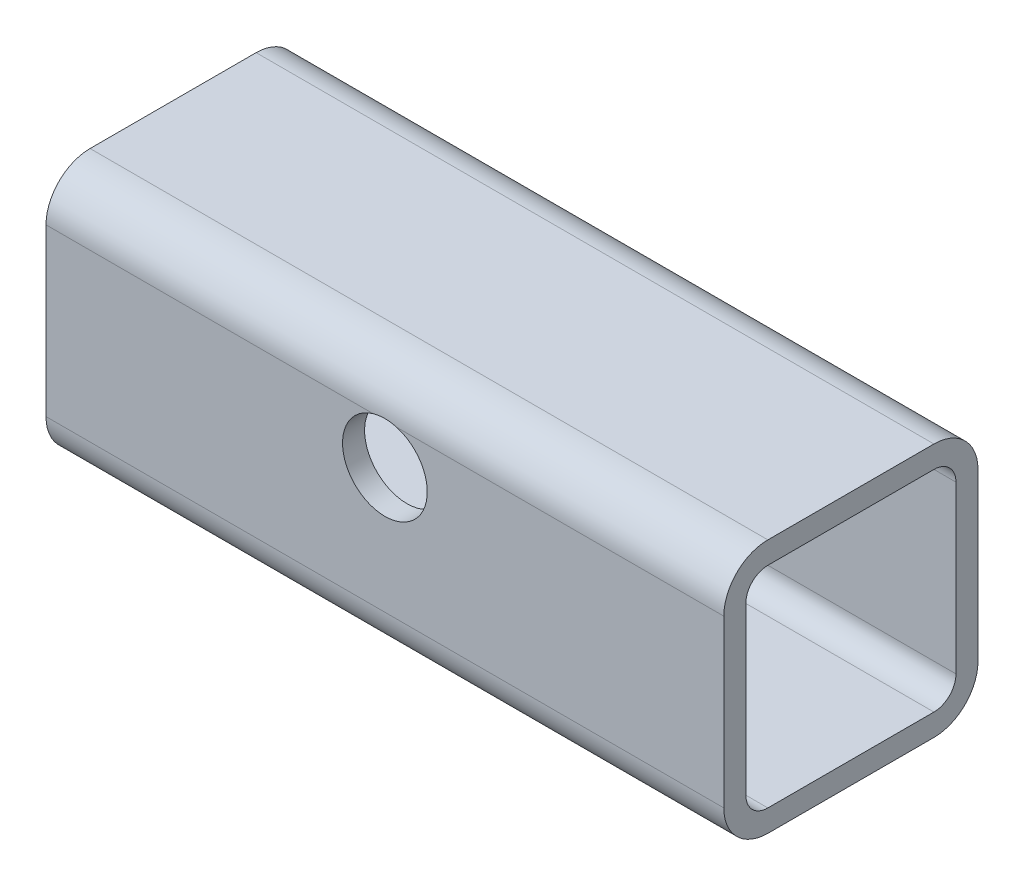
ISO-10303-21;
HEADER;
FILE_DESCRIPTION(('STEP AP214'),'2;1');
FILE_NAME('part.step','',(''),(''),'','','');
FILE_SCHEMA(('AUTOMOTIVE_DESIGN { 1 0 10303 214 1 1 1 1 }'));
ENDSEC;
DATA;
#1=APPLICATION_CONTEXT('core data for automotive mechanical design processes');
#2=APPLICATION_PROTOCOL_DEFINITION('international standard','automotive_design',2000,#1);
#3=PRODUCT_CONTEXT('',#1,'mechanical');
#4=PRODUCT('Part','Part','',(#3));
#5=PRODUCT_RELATED_PRODUCT_CATEGORY('part','',(#4));
#6=PRODUCT_DEFINITION_FORMATION('','',#4);
#7=PRODUCT_DEFINITION_CONTEXT('part definition',#1,'design');
#8=PRODUCT_DEFINITION('design','',#6,#7);
#9=PRODUCT_DEFINITION_SHAPE('','',#8);
#10=(LENGTH_UNIT() NAMED_UNIT(*) SI_UNIT(.MILLI.,.METRE.));
#11=(NAMED_UNIT(*) PLANE_ANGLE_UNIT() SI_UNIT($,.RADIAN.));
#12=(NAMED_UNIT(*) SI_UNIT($,.STERADIAN.) SOLID_ANGLE_UNIT());
#13=UNCERTAINTY_MEASURE_WITH_UNIT(LENGTH_MEASURE(1.E-05),#10,'distance_accuracy_value','');
#14=(GEOMETRIC_REPRESENTATION_CONTEXT(3) GLOBAL_UNCERTAINTY_ASSIGNED_CONTEXT((#13)) GLOBAL_UNIT_ASSIGNED_CONTEXT((#10,
#11,#12)) REPRESENTATION_CONTEXT('',''));
#15=CARTESIAN_POINT('',(0.,0.,0.));
#16=DIRECTION('',(0.,0.,1.));
#17=DIRECTION('',(1.,0.,0.));
#18=AXIS2_PLACEMENT_3D('',#15,#16,#17);
#19=CARTESIAN_POINT('',(80.,9.8,-9.8));
#20=DIRECTION('',(-1.,0.,0.));
#21=DIRECTION('',(0.,0.,1.));
#22=AXIS2_PLACEMENT_3D('',#19,#20,#21);
#23=CYLINDRICAL_SURFACE('',#22,5.2);
#24=DIRECTION('',(-1.,0.,0.));
#25=VECTOR('',#24,1.);
#26=CARTESIAN_POINT('',(80.,9.8,-15.));
#27=LINE('',#26,#25);
#28=CARTESIAN_POINT('',(80.,9.8,-15.));
#29=VERTEX_POINT('',#28);
#30=CARTESIAN_POINT('',(41.4,9.8,-15.));
#31=VERTEX_POINT('',#30);
#32=EDGE_CURVE('E221',#29,#31,#27,.T.);
#33=ORIENTED_EDGE('',*,*,#32,.T.);
#34=CARTESIAN_POINT('',(41.4,9.8,-15.));
#35=CARTESIAN_POINT('',(41.3431557849591,9.81658156900363,-14.9999989720538));
#36=CARTESIAN_POINT('',(41.286021326728,9.83217072184021,-14.9999206417086));
#37=CARTESIAN_POINT('',(41.1714574071763,9.86126958309429,-14.9996595849438));
#38=CARTESIAN_POINT('',(41.1140298994615,9.87478698863816,-14.9994772574498));
#39=CARTESIAN_POINT('',(40.9988797943995,9.8997424563217,-14.999058191233));
#40=CARTESIAN_POINT('',(40.9411583397528,9.91118579016138,-14.9988215940214));
#41=CARTESIAN_POINT('',(40.8254214126575,9.93199648240796,-14.9983348625246));
#42=CARTESIAN_POINT('',(40.767406431461,9.94136657295405,-14.9980847466022));
#43=CARTESIAN_POINT('',(40.6510830015136,9.95803381823512,-14.9976047161396));
#44=CARTESIAN_POINT('',(40.5927745710078,9.96533110026478,-14.9973748003595));
#45=CARTESIAN_POINT('',(40.4758647152712,9.97785607418654,-14.9969612805748));
#46=CARTESIAN_POINT('',(40.417263021649,9.98308126165223,-14.9967777327092));
#47=CARTESIAN_POINT('',(40.2997668530483,9.99146529931364,-14.9964756017275));
#48=CARTESIAN_POINT('',(40.2408720124452,9.99461902658301,-14.9963571797911));
#49=CARTESIAN_POINT('',(40.1227897461331,9.99886309022252,-14.9961964921282));
#50=CARTESIAN_POINT('',(40.0636020449673,9.99994573669491,-14.9961545102505));
#51=CARTESIAN_POINT('',(39.944852214256,10.0000506969647,-14.9961504724372));
#52=CARTESIAN_POINT('',(39.8852900727852,9.99905999991858,-14.9961889212272));
#53=CARTESIAN_POINT('',(39.7664607754381,9.99497347815472,-14.9963438604463));
#54=CARTESIAN_POINT('',(39.7071933492617,9.9918855378676,-14.9964600585584));
#55=CARTESIAN_POINT('',(39.5889538289225,9.98360661333948,-14.996759156126));
#56=CARTESIAN_POINT('',(39.5299813668472,9.9784208831061,-14.9969418888292));
#57=CARTESIAN_POINT('',(39.4123318114976,9.96594846677554,-14.9973550932175));
#58=CARTESIAN_POINT('',(39.3536544457772,9.95866434976154,-14.9975855064303));
#59=CARTESIAN_POINT('',(39.2365949809501,9.94199711915556,-14.9980675601698));
#60=CARTESIAN_POINT('',(39.1782129003298,9.93261387577145,-14.9983192020086));
#61=CARTESIAN_POINT('',(39.0617436033638,9.91175062117661,-14.9988095358786));
#62=CARTESIAN_POINT('',(39.0036568887756,9.90026780884889,-14.9990482100506));
#63=CARTESIAN_POINT('',(38.8877780887966,9.87520716701831,-14.9994713258104));
#64=CARTESIAN_POINT('',(38.8299871725611,9.86162393250286,-14.9996556238099));
#65=CARTESIAN_POINT('',(38.7146982157603,9.83236730610073,-14.9999196380707));
#66=CARTESIAN_POINT('',(38.6572021761365,9.81668602342061,-14.9999989465565));
#67=CARTESIAN_POINT('',(38.6,9.8,-15.));
#68=B_SPLINE_CURVE_WITH_KNOTS('',3,(#34,#35,#36,#37,#38,#39,#40,#41,#42,#43,#44,#45,#46,#47,#48,
#49,#50,#51,#52,#53,#54,#55,#56,#57,#58,#59,#60,#61,#62,#63,#64,#65,#66,#67),.UNSPECIFIED.,.F.,
.F.,(4,2,2,2,2,2,2,2,2,2,2,2,2,2,2,2,4),(0.,0.17763186849784,0.354586892821938,0.53108563987598,
0.707350391326903,0.883604315721005,1.06007062393831,1.2369717238554,1.41452839012144,
1.59320261698632,1.77120882251429,1.94877193689589,2.12611857561295,2.30347618297124,
2.48107215983797,2.65913299220168,2.83788339713574),.UNSPECIFIED.);
#69=CARTESIAN_POINT('',(38.6,9.8,-15.));
#70=VERTEX_POINT('',#69);
#71=EDGE_CURVE('E210',#31,#70,#68,.T.);
#72=ORIENTED_EDGE('',*,*,#71,.T.);
#73=CARTESIAN_POINT('',(0.,9.8,-15.));
#74=VERTEX_POINT('',#73);
#75=EDGE_CURVE('E72',#70,#74,#27,.T.);
#76=ORIENTED_EDGE('',*,*,#75,.T.);
#77=CARTESIAN_POINT('',(0.,9.8,-9.8));
#78=DIRECTION('',(1.,0.,0.));
#79=DIRECTION('',(0.,0.,-1.));
#80=AXIS2_PLACEMENT_3D('',#77,#78,#79);
#81=CIRCLE('',#80,5.2);
#82=CARTESIAN_POINT('',(0.,15.,-9.8));
#83=VERTEX_POINT('',#82);
#84=EDGE_CURVE('E446',#74,#83,#81,.T.);
#85=ORIENTED_EDGE('',*,*,#84,.T.);
#86=DIRECTION('',(-1.,0.,0.));
#87=VECTOR('',#86,1.);
#88=CARTESIAN_POINT('',(80.,15.,-9.8));
#89=LINE('',#88,#87);
#90=CARTESIAN_POINT('',(80.,15.,-9.8));
#91=VERTEX_POINT('',#90);
#92=EDGE_CURVE('E79',#91,#83,#89,.T.);
#93=ORIENTED_EDGE('',*,*,#92,.F.);
#94=CARTESIAN_POINT('',(80.,9.8,-9.8));
#95=DIRECTION('',(1.,0.,0.));
#96=DIRECTION('',(0.,0.,-1.));
#97=AXIS2_PLACEMENT_3D('',#94,#95,#96);
#98=CIRCLE('',#97,5.2);
#99=EDGE_CURVE('E389',#29,#91,#98,.T.);
#100=ORIENTED_EDGE('',*,*,#99,.F.);
#101=EDGE_LOOP('',(#33,#72,#76,#85,#93,#100));
#102=FACE_BOUND('',#101,.T.);
#103=ADVANCED_FACE('F67',(#102),#23,.T.);
#104=CARTESIAN_POINT('',(80.,15.,-9.8));
#105=DIRECTION('',(0.,-1.,0.));
#106=DIRECTION('',(0.,0.,-1.));
#107=AXIS2_PLACEMENT_3D('',#104,#105,#106);
#108=PLANE('',#107);
#109=DIRECTION('',(0.,0.,1.));
#110=VECTOR('',#109,1.);
#111=CARTESIAN_POINT('',(0.,15.,-9.8));
#112=LINE('',#111,#110);
#113=CARTESIAN_POINT('',(0.,15.,9.8));
#114=VERTEX_POINT('',#113);
#115=EDGE_CURVE('E329',#83,#114,#112,.T.);
#116=ORIENTED_EDGE('',*,*,#115,.T.);
#117=DIRECTION('',(-1.,0.,0.));
#118=VECTOR('',#117,1.);
#119=CARTESIAN_POINT('',(80.,15.,9.8));
#120=LINE('',#119,#118);
#121=CARTESIAN_POINT('',(80.,15.,9.8));
#122=VERTEX_POINT('',#121);
#123=EDGE_CURVE('E308',#122,#114,#120,.T.);
#124=ORIENTED_EDGE('',*,*,#123,.F.);
#125=DIRECTION('',(0.,0.,1.));
#126=VECTOR('',#125,1.);
#127=CARTESIAN_POINT('',(80.,15.,-9.8));
#128=LINE('',#127,#126);
#129=EDGE_CURVE('E393',#91,#122,#128,.T.);
#130=ORIENTED_EDGE('',*,*,#129,.F.);
#131=ORIENTED_EDGE('',*,*,#92,.T.);
#132=EDGE_LOOP('',(#116,#124,#130,#131));
#133=FACE_BOUND('',#132,.T.);
#134=ADVANCED_FACE('F269',(#133),#108,.F.);
#135=CARTESIAN_POINT('',(80.,9.8,9.8));
#136=DIRECTION('',(-1.,0.,0.));
#137=DIRECTION('',(0.,0.,1.));
#138=AXIS2_PLACEMENT_3D('',#135,#136,#137);
#139=CYLINDRICAL_SURFACE('',#138,5.2);
#140=DIRECTION('',(-1.,0.,0.));
#141=VECTOR('',#140,1.);
#142=CARTESIAN_POINT('',(80.,9.8,15.));
#143=LINE('',#142,#141);
#144=CARTESIAN_POINT('',(38.6,9.8,15.));
#145=VERTEX_POINT('',#144);
#146=CARTESIAN_POINT('',(0.,9.8,15.));
#147=VERTEX_POINT('',#146);
#148=EDGE_CURVE('E256',#145,#147,#143,.T.);
#149=ORIENTED_EDGE('',*,*,#148,.F.);
#150=CARTESIAN_POINT('',(41.4,9.8,15.));
#151=CARTESIAN_POINT('',(41.3491529439053,9.81483111826522,14.9999681171442));
#152=CARTESIAN_POINT('',(41.2980659313895,9.82885426510369,14.9998816291476));
#153=CARTESIAN_POINT('',(41.1702236160274,9.86177129020494,14.9995773230793));
#154=CARTESIAN_POINT('',(41.0932091518936,9.87966586781765,14.999315820023));
#155=CARTESIAN_POINT('',(40.9675489848588,9.90573953980025,14.9988648614268));
#156=CARTESIAN_POINT('',(40.919132569777,9.91504078543099,14.9986853197788));
#157=CARTESIAN_POINT('',(40.8156265798665,9.93334248611603,14.9982838171331));
#158=CARTESIAN_POINT('',(40.7605010185025,9.94214060260012,14.9980593861503));
#159=CARTESIAN_POINT('',(40.6451607598279,9.95857344700013,14.9975924905294));
#160=CARTESIAN_POINT('',(40.5849219431464,9.96603953767956,14.9973501621667));
#161=CARTESIAN_POINT('',(40.4726214262681,9.97788691407513,14.996937353483));
#162=CARTESIAN_POINT('',(40.42058932418,9.98255301021599,14.9967615671056));
#163=CARTESIAN_POINT('',(40.2895981127596,9.9922329437804,14.9963343411834));
#164=CARTESIAN_POINT('',(40.2105570463711,9.99619077203564,14.9960905048359));
#165=CARTESIAN_POINT('',(40.0861879869144,9.99946247042069,14.995996280124));
#166=CARTESIAN_POINT('',(40.0408879409496,10.0000381300058,14.9960222824834));
#167=CARTESIAN_POINT('',(39.9170033897098,9.9999285301096,14.9963783790303));
#168=CARTESIAN_POINT('',(39.8384162838065,9.99800618914163,14.9969178478119));
#169=CARTESIAN_POINT('',(39.6814228876373,9.99045943770584,14.9977383972759));
#170=CARTESIAN_POINT('',(39.6030165966295,9.98483504245588,14.9980194790204));
#171=CARTESIAN_POINT('',(39.4465555025581,9.96989683767829,14.9985605180255));
#172=CARTESIAN_POINT('',(39.3685006983395,9.96058304028342,14.9988204753555));
#173=CARTESIAN_POINT('',(39.2129170260502,9.93828681073101,14.9992557729465));
#174=CARTESIAN_POINT('',(39.1353881566828,9.92530438762181,14.9994311134161));
#175=CARTESIAN_POINT('',(38.9810285464381,9.89569932705631,14.9997138858353));
#176=CARTESIAN_POINT('',(38.9041978044131,9.87907669558545,14.9998213178964));
#177=CARTESIAN_POINT('',(38.7514048774857,9.84222986345656,14.9999649319156));
#178=CARTESIAN_POINT('',(38.6754426918693,9.82200566575936,15.0000011139323));
#179=CARTESIAN_POINT('',(38.6,9.8,15.));
#180=B_SPLINE_CURVE_WITH_KNOTS('',3,(#150,#151,#152,#153,#154,#155,#156,#157,#158,#159,#160,
#161,#162,#163,#164,#165,#166,#167,#168,#169,#170,#171,#172,#173,#174,#175,#176,#177,#178,#179),
.UNSPECIFIED.,.F.,.F.,(4,2,2,2,2,2,2,2,2,2,2,2,2,2,4),(0.,0.158900873713678,0.396002356912593,
0.543889968775195,0.711329269925978,0.893387288422519,1.0500895569875,1.28740664797233,
1.42330547136926,1.65904608749389,1.89478573457621,2.13052460642471,2.36626289684981,
2.60200079966336,2.83773850867815),.UNSPECIFIED.);
#181=CARTESIAN_POINT('',(41.4,9.8,15.));
#182=VERTEX_POINT('',#181);
#183=EDGE_CURVE('E86',#182,#145,#180,.T.);
#184=ORIENTED_EDGE('',*,*,#183,.F.);
#185=CARTESIAN_POINT('',(80.,9.8,15.));
#186=VERTEX_POINT('',#185);
#187=EDGE_CURVE('E311',#186,#182,#143,.T.);
#188=ORIENTED_EDGE('',*,*,#187,.F.);
#189=CARTESIAN_POINT('',(80.,9.8,9.8));
#190=DIRECTION('',(1.,0.,0.));
#191=DIRECTION('',(0.,0.,-1.));
#192=AXIS2_PLACEMENT_3D('',#189,#190,#191);
#193=CIRCLE('',#192,5.2);
#194=EDGE_CURVE('E396',#122,#186,#193,.T.);
#195=ORIENTED_EDGE('',*,*,#194,.F.);
#196=ORIENTED_EDGE('',*,*,#123,.T.);
#197=CARTESIAN_POINT('',(0.,9.8,9.8));
#198=DIRECTION('',(1.,0.,0.));
#199=DIRECTION('',(0.,0.,-1.));
#200=AXIS2_PLACEMENT_3D('',#197,#198,#199);
#201=CIRCLE('',#200,5.2);
#202=EDGE_CURVE('E324',#114,#147,#201,.T.);
#203=ORIENTED_EDGE('',*,*,#202,.T.);
#204=EDGE_LOOP('',(#149,#184,#188,#195,#196,#203));
#205=FACE_BOUND('',#204,.T.);
#206=ADVANCED_FACE('F258',(#205),#139,.T.);
#207=CARTESIAN_POINT('',(80.,-9.8,15.));
#208=DIRECTION('',(0.,0.,-1.));
#209=DIRECTION('',(-1.,0.,0.));
#210=AXIS2_PLACEMENT_3D('',#207,#208,#209);
#211=PLANE('',#210);
#212=ORIENTED_EDGE('',*,*,#187,.T.);
#213=CARTESIAN_POINT('',(40.,5.,15.));
#214=DIRECTION('',(0.,0.,1.));
#215=DIRECTION('',(1.,0.,0.));
#216=AXIS2_PLACEMENT_3D('',#213,#214,#215);
#217=CIRCLE('',#216,5.);
#218=EDGE_CURVE('E322',#145,#182,#217,.T.);
#219=ORIENTED_EDGE('',*,*,#218,.F.);
#220=ORIENTED_EDGE('',*,*,#148,.T.);
#221=DIRECTION('',(0.,-1.,0.));
#222=VECTOR('',#221,1.);
#223=CARTESIAN_POINT('',(0.,-9.8,15.));
#224=LINE('',#223,#222);
#225=CARTESIAN_POINT('',(0.,-9.8,15.));
#226=VERTEX_POINT('',#225);
#227=EDGE_CURVE('E321',#147,#226,#224,.T.);
#228=ORIENTED_EDGE('',*,*,#227,.T.);
#229=DIRECTION('',(-1.,0.,0.));
#230=VECTOR('',#229,1.);
#231=CARTESIAN_POINT('',(80.,-9.8,15.));
#232=LINE('',#231,#230);
#233=CARTESIAN_POINT('',(80.,-9.8,15.));
#234=VERTEX_POINT('',#233);
#235=EDGE_CURVE('E303',#234,#226,#232,.T.);
#236=ORIENTED_EDGE('',*,*,#235,.F.);
#237=DIRECTION('',(0.,-1.,0.));
#238=VECTOR('',#237,1.);
#239=CARTESIAN_POINT('',(80.,-9.8,15.));
#240=LINE('',#239,#238);
#241=EDGE_CURVE('E399',#186,#234,#240,.T.);
#242=ORIENTED_EDGE('',*,*,#241,.F.);
#243=EDGE_LOOP('',(#212,#219,#220,#228,#236,#242));
#244=FACE_BOUND('',#243,.T.);
#245=ADVANCED_FACE('F268',(#244),#211,.F.);
#246=CARTESIAN_POINT('',(80.,-9.8,9.8));
#247=DIRECTION('',(-1.,0.,0.));
#248=DIRECTION('',(0.,0.,1.));
#249=AXIS2_PLACEMENT_3D('',#246,#247,#248);
#250=CYLINDRICAL_SURFACE('',#249,5.2);
#251=CARTESIAN_POINT('',(0.,-9.8,9.8));
#252=DIRECTION('',(1.,0.,0.));
#253=DIRECTION('',(0.,0.,-1.));
#254=AXIS2_PLACEMENT_3D('',#251,#252,#253);
#255=CIRCLE('',#254,5.2);
#256=CARTESIAN_POINT('',(0.,-15.,9.8));
#257=VERTEX_POINT('',#256);
#258=EDGE_CURVE('E334',#226,#257,#255,.T.);
#259=ORIENTED_EDGE('',*,*,#258,.T.);
#260=DIRECTION('',(-1.,0.,0.));
#261=VECTOR('',#260,1.);
#262=CARTESIAN_POINT('',(80.,-15.,9.8));
#263=LINE('',#262,#261);
#264=CARTESIAN_POINT('',(80.,-15.,9.8));
#265=VERTEX_POINT('',#264);
#266=EDGE_CURVE('E299',#265,#257,#263,.T.);
#267=ORIENTED_EDGE('',*,*,#266,.F.);
#268=CARTESIAN_POINT('',(80.,-9.8,9.8));
#269=DIRECTION('',(1.,0.,0.));
#270=DIRECTION('',(0.,0.,-1.));
#271=AXIS2_PLACEMENT_3D('',#268,#269,#270);
#272=CIRCLE('',#271,5.2);
#273=EDGE_CURVE('E402',#234,#265,#272,.T.);
#274=ORIENTED_EDGE('',*,*,#273,.F.);
#275=ORIENTED_EDGE('',*,*,#235,.T.);
#276=EDGE_LOOP('',(#259,#267,#274,#275));
#277=FACE_BOUND('',#276,.T.);
#278=ADVANCED_FACE('F552',(#277),#250,.T.);
#279=CARTESIAN_POINT('',(80.,-15.,9.8));
#280=DIRECTION('',(0.,1.,0.));
#281=DIRECTION('',(0.,0.,1.));
#282=AXIS2_PLACEMENT_3D('',#279,#280,#281);
#283=PLANE('',#282);
#284=DIRECTION('',(0.,0.,-1.));
#285=VECTOR('',#284,1.);
#286=CARTESIAN_POINT('',(0.,-15.,9.8));
#287=LINE('',#286,#285);
#288=CARTESIAN_POINT('',(0.,-15.,-9.8));
#289=VERTEX_POINT('',#288);
#290=EDGE_CURVE('E338',#257,#289,#287,.T.);
#291=ORIENTED_EDGE('',*,*,#290,.T.);
#292=DIRECTION('',(-1.,0.,0.));
#293=VECTOR('',#292,1.);
#294=CARTESIAN_POINT('',(80.,-15.,-9.8));
#295=LINE('',#294,#293);
#296=CARTESIAN_POINT('',(80.,-15.,-9.8));
#297=VERTEX_POINT('',#296);
#298=EDGE_CURVE('E295',#297,#289,#295,.T.);
#299=ORIENTED_EDGE('',*,*,#298,.F.);
#300=DIRECTION('',(0.,0.,-1.));
#301=VECTOR('',#300,1.);
#302=CARTESIAN_POINT('',(80.,-15.,9.8));
#303=LINE('',#302,#301);
#304=EDGE_CURVE('E405',#265,#297,#303,.T.);
#305=ORIENTED_EDGE('',*,*,#304,.F.);
#306=ORIENTED_EDGE('',*,*,#266,.T.);
#307=EDGE_LOOP('',(#291,#299,#305,#306));
#308=FACE_BOUND('',#307,.T.);
#309=ADVANCED_FACE('F547',(#308),#283,.F.);
#310=CARTESIAN_POINT('',(80.,-9.8,-9.8));
#311=DIRECTION('',(-1.,0.,0.));
#312=DIRECTION('',(0.,0.,1.));
#313=AXIS2_PLACEMENT_3D('',#310,#311,#312);
#314=CYLINDRICAL_SURFACE('',#313,5.2);
#315=CARTESIAN_POINT('',(0.,-9.8,-9.8));
#316=DIRECTION('',(1.,0.,0.));
#317=DIRECTION('',(0.,0.,-1.));
#318=AXIS2_PLACEMENT_3D('',#315,#316,#317);
#319=CIRCLE('',#318,5.2);
#320=CARTESIAN_POINT('',(0.,-9.8,-15.));
#321=VERTEX_POINT('',#320);
#322=EDGE_CURVE('E343',#289,#321,#319,.T.);
#323=ORIENTED_EDGE('',*,*,#322,.T.);
#324=DIRECTION('',(-1.,0.,0.));
#325=VECTOR('',#324,1.);
#326=CARTESIAN_POINT('',(80.,-9.8,-15.));
#327=LINE('',#326,#325);
#328=CARTESIAN_POINT('',(80.,-9.8,-15.));
#329=VERTEX_POINT('',#328);
#330=EDGE_CURVE('E235',#329,#321,#327,.T.);
#331=ORIENTED_EDGE('',*,*,#330,.F.);
#332=CARTESIAN_POINT('',(80.,-9.8,-9.8));
#333=DIRECTION('',(1.,0.,0.));
#334=DIRECTION('',(0.,0.,-1.));
#335=AXIS2_PLACEMENT_3D('',#332,#333,#334);
#336=CIRCLE('',#335,5.2);
#337=EDGE_CURVE('E408',#297,#329,#336,.T.);
#338=ORIENTED_EDGE('',*,*,#337,.F.);
#339=ORIENTED_EDGE('',*,*,#298,.T.);
#340=EDGE_LOOP('',(#323,#331,#338,#339));
#341=FACE_BOUND('',#340,.T.);
#342=ADVANCED_FACE('F542',(#341),#314,.T.);
#343=CARTESIAN_POINT('',(80.,9.8,9.8));
#344=DIRECTION('',(-1.,0.,0.));
#345=DIRECTION('',(0.,0.,1.));
#346=AXIS2_PLACEMENT_3D('',#343,#344,#345);
#347=CYLINDRICAL_SURFACE('',#346,2.6);
#348=CARTESIAN_POINT('',(38.6,9.8,12.4));
#349=CARTESIAN_POINT('',(38.6682218028846,9.81989801218617,12.3999963920888));
#350=CARTESIAN_POINT('',(38.7368586872689,9.83833872609493,12.3997720826648));
#351=CARTESIAN_POINT('',(38.8748536764175,9.87227825565255,12.3990512345332));
#352=CARTESIAN_POINT('',(38.94421177114,9.88777711220434,12.3985546996109));
#353=CARTESIAN_POINT('',(39.153203818833,9.92982000850826,12.3969105248649));
#354=CARTESIAN_POINT('',(39.2937589814304,9.95191137956892,12.3956082978441));
#355=CARTESIAN_POINT('',(39.5729353294105,9.98366253841054,12.393552550057));
#356=CARTESIAN_POINT('',(39.7115251990587,9.99360016520899,12.3927869438548));
#357=CARTESIAN_POINT('',(39.9889953313389,10.001914430985,12.392149721752));
#358=CARTESIAN_POINT('',(40.1278754907363,10.00029464967,12.3922778290388));
#359=CARTESIAN_POINT('',(40.4566972047727,9.98273704661954,12.3935990279105));
#360=CARTESIAN_POINT('',(40.6463990808293,9.96169312354255,12.3951708571664));
#361=CARTESIAN_POINT('',(40.9296452115551,9.9137719603034,12.397555537091));
#362=CARTESIAN_POINT('',(41.0246115505461,9.89484914502915,12.3983616050628));
#363=CARTESIAN_POINT('',(41.2133055625079,9.8515207942107,12.3995779711224));
#364=CARTESIAN_POINT('',(41.3070330082341,9.82711426719503,12.3999881975698));
#365=CARTESIAN_POINT('',(41.4,9.8,12.4));
#366=B_SPLINE_CURVE_WITH_KNOTS('',3,(#348,#349,#350,#351,#352,#353,#354,#355,#356,#357,#358,
#359,#360,#361,#362,#363,#364,#365),.UNSPECIFIED.,.F.,.F.,(4,2,2,2,2,2,2,2,4),(0.,
0.213158048087099,0.426313132255314,0.852612567278017,1.26897263338285,1.68520374474832,
2.25639796525296,2.5467700750208,2.83719472724097),.UNSPECIFIED.);
#367=CARTESIAN_POINT('',(38.6,9.8,12.4));
#368=VERTEX_POINT('',#367);
#369=CARTESIAN_POINT('',(41.4,9.8,12.4));
#370=VERTEX_POINT('',#369);
#371=EDGE_CURVE('E496',#368,#370,#366,.T.);
#372=ORIENTED_EDGE('',*,*,#371,.F.);
#373=DIRECTION('',(-1.,0.,0.));
#374=VECTOR('',#373,1.);
#375=CARTESIAN_POINT('',(80.,9.8,12.4));
#376=LINE('',#375,#374);
#377=CARTESIAN_POINT('',(0.,9.8,12.4));
#378=VERTEX_POINT('',#377);
#379=EDGE_CURVE('E414',#368,#378,#376,.T.);
#380=ORIENTED_EDGE('',*,*,#379,.T.);
#381=CARTESIAN_POINT('',(0.,9.8,9.8));
#382=DIRECTION('',(1.,0.,0.));
#383=DIRECTION('',(0.,0.,-1.));
#384=AXIS2_PLACEMENT_3D('',#381,#382,#383);
#385=CIRCLE('',#384,2.6);
#386=CARTESIAN_POINT('',(0.,12.4,9.8));
#387=VERTEX_POINT('',#386);
#388=EDGE_CURVE('E223',#387,#378,#385,.T.);
#389=ORIENTED_EDGE('',*,*,#388,.F.);
#390=DIRECTION('',(-1.,0.,0.));
#391=VECTOR('',#390,1.);
#392=CARTESIAN_POINT('',(80.,12.4,9.8));
#393=LINE('',#392,#391);
#394=CARTESIAN_POINT('',(80.,12.4,9.8));
#395=VERTEX_POINT('',#394);
#396=EDGE_CURVE('E232',#395,#387,#393,.T.);
#397=ORIENTED_EDGE('',*,*,#396,.F.);
#398=CARTESIAN_POINT('',(80.,9.8,9.8));
#399=DIRECTION('',(1.,0.,0.));
#400=DIRECTION('',(0.,0.,-1.));
#401=AXIS2_PLACEMENT_3D('',#398,#399,#400);
#402=CIRCLE('',#401,2.6);
#403=CARTESIAN_POINT('',(80.,9.8,12.4));
#404=VERTEX_POINT('',#403);
#405=EDGE_CURVE('E349',#395,#404,#402,.T.);
#406=ORIENTED_EDGE('',*,*,#405,.T.);
#407=EDGE_CURVE('E453',#404,#370,#376,.T.);
#408=ORIENTED_EDGE('',*,*,#407,.T.);
#409=EDGE_LOOP('',(#372,#380,#389,#397,#406,#408));
#410=FACE_BOUND('',#409,.T.);
#411=ADVANCED_FACE('F69',(#410),#347,.F.);
#412=CARTESIAN_POINT('',(80.,12.4,-9.8));
#413=DIRECTION('',(0.,-1.,0.));
#414=DIRECTION('',(0.,0.,-1.));
#415=AXIS2_PLACEMENT_3D('',#412,#413,#414);
#416=PLANE('',#415);
#417=DIRECTION('',(0.,0.,1.));
#418=VECTOR('',#417,1.);
#419=CARTESIAN_POINT('',(0.,12.4,-9.8));
#420=LINE('',#419,#418);
#421=CARTESIAN_POINT('',(0.,12.4,-9.8));
#422=VERTEX_POINT('',#421);
#423=EDGE_CURVE('E418',#422,#387,#420,.T.);
#424=ORIENTED_EDGE('',*,*,#423,.F.);
#425=DIRECTION('',(-1.,0.,0.));
#426=VECTOR('',#425,1.);
#427=CARTESIAN_POINT('',(80.,12.4,-9.8));
#428=LINE('',#427,#426);
#429=CARTESIAN_POINT('',(80.,12.4,-9.8));
#430=VERTEX_POINT('',#429);
#431=EDGE_CURVE('E236',#430,#422,#428,.T.);
#432=ORIENTED_EDGE('',*,*,#431,.F.);
#433=DIRECTION('',(0.,0.,1.));
#434=VECTOR('',#433,1.);
#435=CARTESIAN_POINT('',(80.,12.4,-9.8));
#436=LINE('',#435,#434);
#437=EDGE_CURVE('E352',#430,#395,#436,.T.);
#438=ORIENTED_EDGE('',*,*,#437,.T.);
#439=ORIENTED_EDGE('',*,*,#396,.T.);
#440=EDGE_LOOP('',(#424,#432,#438,#439));
#441=FACE_BOUND('',#440,.T.);
#442=ADVANCED_FACE('F541',(#441),#416,.T.);
#443=CARTESIAN_POINT('',(80.,9.8,-9.8));
#444=DIRECTION('',(-1.,0.,0.));
#445=DIRECTION('',(0.,0.,1.));
#446=AXIS2_PLACEMENT_3D('',#443,#444,#445);
#447=CYLINDRICAL_SURFACE('',#446,2.6);
#448=CARTESIAN_POINT('',(41.4,9.8,-12.4));
#449=CARTESIAN_POINT('',(41.3317781971154,9.81989801218617,-12.3999963920888));
#450=CARTESIAN_POINT('',(41.2631413127311,9.83833872609493,-12.3997720826648));
#451=CARTESIAN_POINT('',(41.1251463235825,9.87227825565255,-12.3990512345332));
#452=CARTESIAN_POINT('',(41.05578822886,9.88777711220434,-12.3985546996109));
#453=CARTESIAN_POINT('',(40.846796181167,9.92982000850826,-12.3969105248649));
#454=CARTESIAN_POINT('',(40.7062410185696,9.95191137956892,-12.3956082978441));
#455=CARTESIAN_POINT('',(40.4270646705895,9.98366253841054,-12.393552550057));
#456=CARTESIAN_POINT('',(40.2884748009413,9.99360016520899,-12.3927869438548));
#457=CARTESIAN_POINT('',(40.0110046686611,10.001914430985,-12.392149721752));
#458=CARTESIAN_POINT('',(39.8721245092637,10.00029464967,-12.3922778290388));
#459=CARTESIAN_POINT('',(39.5433027952273,9.98273704661954,-12.3935990279105));
#460=CARTESIAN_POINT('',(39.3536009191707,9.96169312354255,-12.3951708571664));
#461=CARTESIAN_POINT('',(39.0703547884449,9.9137719603034,-12.397555537091));
#462=CARTESIAN_POINT('',(38.9753884494539,9.89484914502915,-12.3983616050628));
#463=CARTESIAN_POINT('',(38.7866944374921,9.8515207942107,-12.3995779711224));
#464=CARTESIAN_POINT('',(38.6929669917659,9.82711426719503,-12.3999881975698));
#465=CARTESIAN_POINT('',(38.6,9.8,-12.4));
#466=B_SPLINE_CURVE_WITH_KNOTS('',3,(#448,#449,#450,#451,#452,#453,#454,#455,#456,#457,#458,
#459,#460,#461,#462,#463,#464,#465),.UNSPECIFIED.,.F.,.F.,(4,2,2,2,2,2,2,2,4),(0.,
0.213158048087099,0.426313132255314,0.852612567278017,1.26897263338285,1.68520374474832,
2.25639796525296,2.5467700750208,2.83719472724097),.UNSPECIFIED.);
#467=CARTESIAN_POINT('',(41.4,9.8,-12.4));
#468=VERTEX_POINT('',#467);
#469=CARTESIAN_POINT('',(38.6,9.8,-12.4));
#470=VERTEX_POINT('',#469);
#471=EDGE_CURVE('E94',#468,#470,#466,.T.);
#472=ORIENTED_EDGE('',*,*,#471,.F.);
#473=DIRECTION('',(-1.,0.,0.));
#474=VECTOR('',#473,1.);
#475=CARTESIAN_POINT('',(80.,9.8,-12.4));
#476=LINE('',#475,#474);
#477=CARTESIAN_POINT('',(80.,9.8,-12.4));
#478=VERTEX_POINT('',#477);
#479=EDGE_CURVE('E243',#478,#468,#476,.T.);
#480=ORIENTED_EDGE('',*,*,#479,.F.);
#481=CARTESIAN_POINT('',(80.,9.8,-9.8));
#482=DIRECTION('',(1.,0.,0.));
#483=DIRECTION('',(0.,0.,-1.));
#484=AXIS2_PLACEMENT_3D('',#481,#482,#483);
#485=CIRCLE('',#484,2.6);
#486=EDGE_CURVE('E359',#478,#430,#485,.T.);
#487=ORIENTED_EDGE('',*,*,#486,.T.);
#488=ORIENTED_EDGE('',*,*,#431,.T.);
#489=CARTESIAN_POINT('',(0.,9.8,-9.8));
#490=DIRECTION('',(1.,0.,0.));
#491=DIRECTION('',(0.,0.,-1.));
#492=AXIS2_PLACEMENT_3D('',#489,#490,#491);
#493=CIRCLE('',#492,2.6);
#494=CARTESIAN_POINT('',(0.,9.8,-12.4));
#495=VERTEX_POINT('',#494);
#496=EDGE_CURVE('E422',#495,#422,#493,.T.);
#497=ORIENTED_EDGE('',*,*,#496,.F.);
#498=EDGE_CURVE('E467',#470,#495,#476,.T.);
#499=ORIENTED_EDGE('',*,*,#498,.F.);
#500=EDGE_LOOP('',(#472,#480,#487,#488,#497,#499));
#501=FACE_BOUND('',#500,.T.);
#502=ADVANCED_FACE('F478',(#501),#447,.F.);
#503=CARTESIAN_POINT('',(80.,9.8,-12.4));
#504=DIRECTION('',(0.,0.,1.));
#505=DIRECTION('',(1.,0.,0.));
#506=AXIS2_PLACEMENT_3D('',#503,#504,#505);
#507=PLANE('',#506);
#508=CARTESIAN_POINT('',(40.,5.,-12.4));
#509=DIRECTION('',(0.,0.,1.));
#510=DIRECTION('',(1.,0.,0.));
#511=AXIS2_PLACEMENT_3D('',#508,#509,#510);
#512=CIRCLE('',#511,5.);
#513=EDGE_CURVE('E476',#470,#468,#512,.T.);
#514=ORIENTED_EDGE('',*,*,#513,.F.);
#515=ORIENTED_EDGE('',*,*,#498,.T.);
#516=DIRECTION('',(0.,1.,0.));
#517=VECTOR('',#516,1.);
#518=CARTESIAN_POINT('',(0.,9.8,-12.4));
#519=LINE('',#518,#517);
#520=CARTESIAN_POINT('',(0.,-9.8,-12.4));
#521=VERTEX_POINT('',#520);
#522=EDGE_CURVE('E426',#521,#495,#519,.T.);
#523=ORIENTED_EDGE('',*,*,#522,.F.);
#524=DIRECTION('',(-1.,0.,0.));
#525=VECTOR('',#524,1.);
#526=CARTESIAN_POINT('',(80.,-9.8,-12.4));
#527=LINE('',#526,#525);
#528=CARTESIAN_POINT('',(80.,-9.8,-12.4));
#529=VERTEX_POINT('',#528);
#530=EDGE_CURVE('E465',#529,#521,#527,.T.);
#531=ORIENTED_EDGE('',*,*,#530,.F.);
#532=DIRECTION('',(0.,1.,0.));
#533=VECTOR('',#532,1.);
#534=CARTESIAN_POINT('',(80.,9.8,-12.4));
#535=LINE('',#534,#533);
#536=EDGE_CURVE('E369',#529,#478,#535,.T.);
#537=ORIENTED_EDGE('',*,*,#536,.T.);
#538=ORIENTED_EDGE('',*,*,#479,.T.);
#539=EDGE_LOOP('',(#514,#515,#523,#531,#537,#538));
#540=FACE_BOUND('',#539,.T.);
#541=ADVANCED_FACE('F475',(#540),#507,.T.);
#542=CARTESIAN_POINT('',(80.,-9.8,-9.8));
#543=DIRECTION('',(-1.,0.,0.));
#544=DIRECTION('',(0.,0.,1.));
#545=AXIS2_PLACEMENT_3D('',#542,#543,#544);
#546=CYLINDRICAL_SURFACE('',#545,2.6);
#547=CARTESIAN_POINT('',(0.,-9.8,-9.8));
#548=DIRECTION('',(1.,0.,0.));
#549=DIRECTION('',(0.,0.,-1.));
#550=AXIS2_PLACEMENT_3D('',#547,#548,#549);
#551=CIRCLE('',#550,2.6);
#552=CARTESIAN_POINT('',(0.,-12.4,-9.8));
#553=VERTEX_POINT('',#552);
#554=EDGE_CURVE('E430',#553,#521,#551,.T.);
#555=ORIENTED_EDGE('',*,*,#554,.F.);
#556=DIRECTION('',(-1.,0.,0.));
#557=VECTOR('',#556,1.);
#558=CARTESIAN_POINT('',(80.,-12.4,-9.8));
#559=LINE('',#558,#557);
#560=CARTESIAN_POINT('',(80.,-12.4,-9.8));
#561=VERTEX_POINT('',#560);
#562=EDGE_CURVE('E462',#561,#553,#559,.T.);
#563=ORIENTED_EDGE('',*,*,#562,.F.);
#564=CARTESIAN_POINT('',(80.,-9.8,-9.8));
#565=DIRECTION('',(1.,0.,0.));
#566=DIRECTION('',(0.,0.,-1.));
#567=AXIS2_PLACEMENT_3D('',#564,#565,#566);
#568=CIRCLE('',#567,2.6);
#569=EDGE_CURVE('E373',#561,#529,#568,.T.);
#570=ORIENTED_EDGE('',*,*,#569,.T.);
#571=ORIENTED_EDGE('',*,*,#530,.T.);
#572=EDGE_LOOP('',(#555,#563,#570,#571));
#573=FACE_BOUND('',#572,.T.);
#574=ADVANCED_FACE('F483',(#573),#546,.F.);
#575=CARTESIAN_POINT('',(80.,-12.4,9.8));
#576=DIRECTION('',(0.,1.,0.));
#577=DIRECTION('',(0.,0.,1.));
#578=AXIS2_PLACEMENT_3D('',#575,#576,#577);
#579=PLANE('',#578);
#580=DIRECTION('',(0.,0.,-1.));
#581=VECTOR('',#580,1.);
#582=CARTESIAN_POINT('',(0.,-12.4,9.8));
#583=LINE('',#582,#581);
#584=CARTESIAN_POINT('',(0.,-12.4,9.8));
#585=VERTEX_POINT('',#584);
#586=EDGE_CURVE('E434',#585,#553,#583,.T.);
#587=ORIENTED_EDGE('',*,*,#586,.F.);
#588=DIRECTION('',(-1.,0.,0.));
#589=VECTOR('',#588,1.);
#590=CARTESIAN_POINT('',(80.,-12.4,9.8));
#591=LINE('',#590,#589);
#592=CARTESIAN_POINT('',(80.,-12.4,9.8));
#593=VERTEX_POINT('',#592);
#594=EDGE_CURVE('E459',#593,#585,#591,.T.);
#595=ORIENTED_EDGE('',*,*,#594,.F.);
#596=DIRECTION('',(0.,0.,-1.));
#597=VECTOR('',#596,1.);
#598=CARTESIAN_POINT('',(80.,-12.4,9.8));
#599=LINE('',#598,#597);
#600=EDGE_CURVE('E377',#593,#561,#599,.T.);
#601=ORIENTED_EDGE('',*,*,#600,.T.);
#602=ORIENTED_EDGE('',*,*,#562,.T.);
#603=EDGE_LOOP('',(#587,#595,#601,#602));
#604=FACE_BOUND('',#603,.T.);
#605=ADVANCED_FACE('F579',(#604),#579,.T.);
#606=CARTESIAN_POINT('',(80.,-9.8,9.8));
#607=DIRECTION('',(-1.,0.,0.));
#608=DIRECTION('',(0.,0.,1.));
#609=AXIS2_PLACEMENT_3D('',#606,#607,#608);
#610=CYLINDRICAL_SURFACE('',#609,2.6);
#611=CARTESIAN_POINT('',(0.,-9.8,9.8));
#612=DIRECTION('',(1.,0.,0.));
#613=DIRECTION('',(0.,0.,-1.));
#614=AXIS2_PLACEMENT_3D('',#611,#612,#613);
#615=CIRCLE('',#614,2.6);
#616=CARTESIAN_POINT('',(0.,-9.8,12.4));
#617=VERTEX_POINT('',#616);
#618=EDGE_CURVE('E438',#617,#585,#615,.T.);
#619=ORIENTED_EDGE('',*,*,#618,.F.);
#620=DIRECTION('',(-1.,0.,0.));
#621=VECTOR('',#620,1.);
#622=CARTESIAN_POINT('',(80.,-9.8,12.4));
#623=LINE('',#622,#621);
#624=CARTESIAN_POINT('',(80.,-9.8,12.4));
#625=VERTEX_POINT('',#624);
#626=EDGE_CURVE('E456',#625,#617,#623,.T.);
#627=ORIENTED_EDGE('',*,*,#626,.F.);
#628=CARTESIAN_POINT('',(80.,-9.8,9.8));
#629=DIRECTION('',(1.,0.,0.));
#630=DIRECTION('',(0.,0.,-1.));
#631=AXIS2_PLACEMENT_3D('',#628,#629,#630);
#632=CIRCLE('',#631,2.6);
#633=EDGE_CURVE('E381',#625,#593,#632,.T.);
#634=ORIENTED_EDGE('',*,*,#633,.T.);
#635=ORIENTED_EDGE('',*,*,#594,.T.);
#636=EDGE_LOOP('',(#619,#627,#634,#635));
#637=FACE_BOUND('',#636,.T.);
#638=ADVANCED_FACE('F575',(#637),#610,.F.);
#639=CARTESIAN_POINT('',(80.,-9.8,12.4));
#640=DIRECTION('',(0.,0.,-1.));
#641=DIRECTION('',(-1.,0.,0.));
#642=AXIS2_PLACEMENT_3D('',#639,#640,#641);
#643=PLANE('',#642);
#644=CARTESIAN_POINT('',(40.,5.,12.4));
#645=DIRECTION('',(0.,0.,-1.));
#646=DIRECTION('',(-1.,0.,0.));
#647=AXIS2_PLACEMENT_3D('',#644,#645,#646);
#648=CIRCLE('',#647,5.);
#649=EDGE_CURVE('E530',#370,#368,#648,.T.);
#650=ORIENTED_EDGE('',*,*,#649,.F.);
#651=ORIENTED_EDGE('',*,*,#407,.F.);
#652=DIRECTION('',(0.,-1.,0.));
#653=VECTOR('',#652,1.);
#654=CARTESIAN_POINT('',(80.,-9.8,12.4));
#655=LINE('',#654,#653);
#656=EDGE_CURVE('E385',#404,#625,#655,.T.);
#657=ORIENTED_EDGE('',*,*,#656,.T.);
#658=ORIENTED_EDGE('',*,*,#626,.T.);
#659=DIRECTION('',(0.,-1.,0.));
#660=VECTOR('',#659,1.);
#661=CARTESIAN_POINT('',(0.,-9.8,12.4));
#662=LINE('',#661,#660);
#663=EDGE_CURVE('E442',#378,#617,#662,.T.);
#664=ORIENTED_EDGE('',*,*,#663,.F.);
#665=ORIENTED_EDGE('',*,*,#379,.F.);
#666=EDGE_LOOP('',(#650,#651,#657,#658,#664,#665));
#667=FACE_BOUND('',#666,.T.);
#668=ADVANCED_FACE('F277',(#667),#643,.T.);
#669=CARTESIAN_POINT('',(80.,9.8,-15.));
#670=DIRECTION('',(0.,0.,1.));
#671=DIRECTION('',(1.,0.,0.));
#672=AXIS2_PLACEMENT_3D('',#669,#670,#671);
#673=PLANE('',#672);
#674=ORIENTED_EDGE('',*,*,#75,.F.);
#675=CARTESIAN_POINT('',(40.,5.,-15.));
#676=DIRECTION('',(0.,0.,1.));
#677=DIRECTION('',(1.,0.,0.));
#678=AXIS2_PLACEMENT_3D('',#675,#676,#677);
#679=CIRCLE('',#678,5.);
#680=EDGE_CURVE('E12',#70,#31,#679,.T.);
#681=ORIENTED_EDGE('',*,*,#680,.T.);
#682=ORIENTED_EDGE('',*,*,#32,.F.);
#683=DIRECTION('',(0.,1.,0.));
#684=VECTOR('',#683,1.);
#685=CARTESIAN_POINT('',(80.,9.8,-15.));
#686=LINE('',#685,#684);
#687=EDGE_CURVE('E411',#329,#29,#686,.T.);
#688=ORIENTED_EDGE('',*,*,#687,.F.);
#689=ORIENTED_EDGE('',*,*,#330,.T.);
#690=DIRECTION('',(0.,1.,0.));
#691=VECTOR('',#690,1.);
#692=CARTESIAN_POINT('',(0.,9.8,-15.));
#693=LINE('',#692,#691);
#694=EDGE_CURVE('E229',#321,#74,#693,.T.);
#695=ORIENTED_EDGE('',*,*,#694,.T.);
#696=EDGE_LOOP('',(#674,#681,#682,#688,#689,#695));
#697=FACE_BOUND('',#696,.T.);
#698=ADVANCED_FACE('F226',(#697),#673,.F.);
#699=CARTESIAN_POINT('',(80.,9.8,-9.8));
#700=DIRECTION('',(1.,0.,0.));
#701=DIRECTION('',(0.,0.,-1.));
#702=AXIS2_PLACEMENT_3D('',#699,#700,#701);
#703=PLANE('',#702);
#704=ORIENTED_EDGE('',*,*,#405,.F.);
#705=ORIENTED_EDGE('',*,*,#437,.F.);
#706=ORIENTED_EDGE('',*,*,#486,.F.);
#707=ORIENTED_EDGE('',*,*,#536,.F.);
#708=ORIENTED_EDGE('',*,*,#569,.F.);
#709=ORIENTED_EDGE('',*,*,#600,.F.);
#710=ORIENTED_EDGE('',*,*,#633,.F.);
#711=ORIENTED_EDGE('',*,*,#656,.F.);
#712=EDGE_LOOP('',(#704,#705,#706,#707,#708,#709,#710,#711));
#713=FACE_BOUND('',#712,.T.);
#714=ORIENTED_EDGE('',*,*,#99,.T.);
#715=ORIENTED_EDGE('',*,*,#129,.T.);
#716=ORIENTED_EDGE('',*,*,#194,.T.);
#717=ORIENTED_EDGE('',*,*,#241,.T.);
#718=ORIENTED_EDGE('',*,*,#273,.T.);
#719=ORIENTED_EDGE('',*,*,#304,.T.);
#720=ORIENTED_EDGE('',*,*,#337,.T.);
#721=ORIENTED_EDGE('',*,*,#687,.T.);
#722=EDGE_LOOP('',(#714,#715,#716,#717,#718,#719,#720,#721));
#723=FACE_BOUND('',#722,.T.);
#724=ADVANCED_FACE('F488',(#713,#723),#703,.T.);
#725=CARTESIAN_POINT('',(0.,9.8,-9.8));
#726=DIRECTION('',(1.,0.,0.));
#727=DIRECTION('',(0.,0.,-1.));
#728=AXIS2_PLACEMENT_3D('',#725,#726,#727);
#729=PLANE('',#728);
#730=ORIENTED_EDGE('',*,*,#388,.T.);
#731=ORIENTED_EDGE('',*,*,#663,.T.);
#732=ORIENTED_EDGE('',*,*,#618,.T.);
#733=ORIENTED_EDGE('',*,*,#586,.T.);
#734=ORIENTED_EDGE('',*,*,#554,.T.);
#735=ORIENTED_EDGE('',*,*,#522,.T.);
#736=ORIENTED_EDGE('',*,*,#496,.T.);
#737=ORIENTED_EDGE('',*,*,#423,.T.);
#738=EDGE_LOOP('',(#730,#731,#732,#733,#734,#735,#736,#737));
#739=FACE_BOUND('',#738,.T.);
#740=ORIENTED_EDGE('',*,*,#84,.F.);
#741=ORIENTED_EDGE('',*,*,#694,.F.);
#742=ORIENTED_EDGE('',*,*,#322,.F.);
#743=ORIENTED_EDGE('',*,*,#290,.F.);
#744=ORIENTED_EDGE('',*,*,#258,.F.);
#745=ORIENTED_EDGE('',*,*,#227,.F.);
#746=ORIENTED_EDGE('',*,*,#202,.F.);
#747=ORIENTED_EDGE('',*,*,#115,.F.);
#748=EDGE_LOOP('',(#740,#741,#742,#743,#744,#745,#746,#747));
#749=FACE_BOUND('',#748,.T.);
#750=ADVANCED_FACE('F332',(#739,#749),#729,.F.);
#751=CARTESIAN_POINT('',(40.,5.,-15.));
#752=DIRECTION('',(0.,0.,1.));
#753=DIRECTION('',(1.,0.,0.));
#754=AXIS2_PLACEMENT_3D('',#751,#752,#753);
#755=CYLINDRICAL_SURFACE('',#754,5.);
#756=ORIENTED_EDGE('',*,*,#471,.T.);
#757=ORIENTED_EDGE('',*,*,#513,.T.);
#758=EDGE_LOOP('',(#756,#757));
#759=FACE_BOUND('',#758,.T.);
#760=ORIENTED_EDGE('',*,*,#680,.F.);
#761=ORIENTED_EDGE('',*,*,#71,.F.);
#762=EDGE_LOOP('',(#760,#761));
#763=FACE_BOUND('',#762,.T.);
#764=ADVANCED_FACE('F209',(#759,#763),#755,.F.);
#765=ORIENTED_EDGE('',*,*,#371,.T.);
#766=ORIENTED_EDGE('',*,*,#649,.T.);
#767=EDGE_LOOP('',(#765,#766));
#768=FACE_BOUND('',#767,.T.);
#769=ORIENTED_EDGE('',*,*,#218,.T.);
#770=ORIENTED_EDGE('',*,*,#183,.T.);
#771=EDGE_LOOP('',(#769,#770));
#772=FACE_BOUND('',#771,.T.);
#773=ADVANCED_FACE('F510',(#768,#772),#755,.F.);
#774=CLOSED_SHELL('',(#103,#134,#206,#245,#278,#309,#342,#411,#442,#502,#541,#574,#605,#638,
#668,#698,#724,#750,#764,#773));
#775=MANIFOLD_SOLID_BREP('B2',#774);
#776=ADVANCED_BREP_SHAPE_REPRESENTATION('',(#18,#775),#14);
#777=SHAPE_DEFINITION_REPRESENTATION(#9,#776);
ENDSEC;
END-ISO-10303-21;
